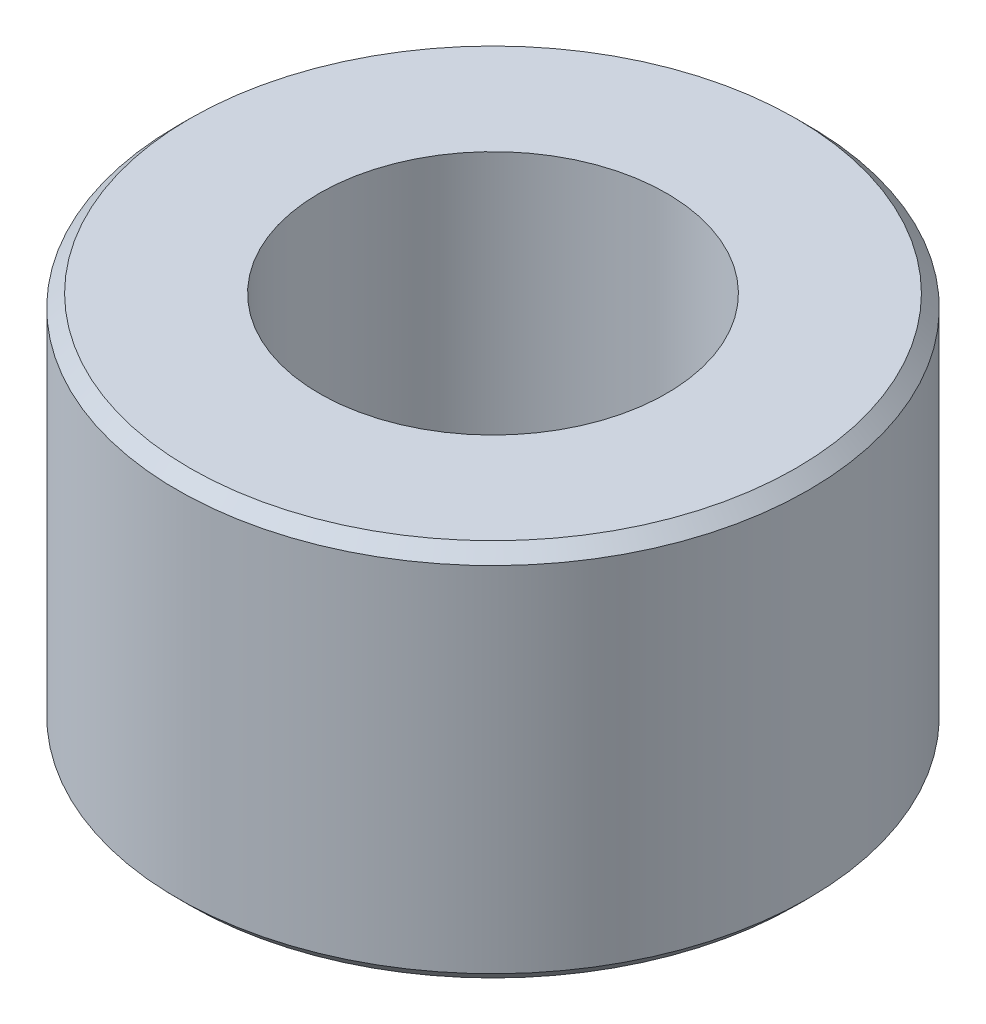
ISO-10303-21;
HEADER;
FILE_DESCRIPTION(('STEP AP214'),'2;1');
FILE_NAME('part.step','',(''),(''),'','','');
FILE_SCHEMA(('AUTOMOTIVE_DESIGN { 1 0 10303 214 1 1 1 1 }'));
ENDSEC;
DATA;
#1=APPLICATION_CONTEXT('core data for automotive mechanical design processes');
#2=APPLICATION_PROTOCOL_DEFINITION('international standard','automotive_design',2000,#1);
#3=PRODUCT_CONTEXT('',#1,'mechanical');
#4=PRODUCT('Part','Part','',(#3));
#5=PRODUCT_RELATED_PRODUCT_CATEGORY('part','',(#4));
#6=PRODUCT_DEFINITION_FORMATION('','',#4);
#7=PRODUCT_DEFINITION_CONTEXT('part definition',#1,'design');
#8=PRODUCT_DEFINITION('design','',#6,#7);
#9=PRODUCT_DEFINITION_SHAPE('','',#8);
#10=(LENGTH_UNIT() NAMED_UNIT(*) SI_UNIT(.MILLI.,.METRE.));
#11=(NAMED_UNIT(*) PLANE_ANGLE_UNIT() SI_UNIT($,.RADIAN.));
#12=(NAMED_UNIT(*) SI_UNIT($,.STERADIAN.) SOLID_ANGLE_UNIT());
#13=UNCERTAINTY_MEASURE_WITH_UNIT(LENGTH_MEASURE(1.E-05),#10,'distance_accuracy_value','');
#14=(GEOMETRIC_REPRESENTATION_CONTEXT(3) GLOBAL_UNCERTAINTY_ASSIGNED_CONTEXT((#13)) GLOBAL_UNIT_ASSIGNED_CONTEXT((#10,
#11,#12)) REPRESENTATION_CONTEXT('',''));
#15=CARTESIAN_POINT('',(0.,0.,0.));
#16=DIRECTION('',(0.,0.,1.));
#17=DIRECTION('',(1.,0.,0.));
#18=AXIS2_PLACEMENT_3D('',#15,#16,#17);
#19=CARTESIAN_POINT('',(0.,0.1,0.));
#20=DIRECTION('',(0.,1.,0.));
#21=DIRECTION('',(1.,0.,0.));
#22=AXIS2_PLACEMENT_3D('',#19,#20,#21);
#23=CONICAL_SURFACE('',#22,4.9,0.785398163397449);
#24=CARTESIAN_POINT('',(0.,0.2,0.));
#25=DIRECTION('',(0.,-1.,0.));
#26=DIRECTION('',(1.,0.,0.));
#27=AXIS2_PLACEMENT_3D('',#24,#25,#26);
#28=CIRCLE('',#27,5.);
#29=CARTESIAN_POINT('',(-5.,0.2,0.));
#30=VERTEX_POINT('',#29);
#31=EDGE_CURVE('E11',#30,#30,#28,.T.);
#32=ORIENTED_EDGE('',*,*,#31,.T.);
#33=EDGE_LOOP('',(#32));
#34=FACE_BOUND('',#33,.T.);
#35=CARTESIAN_POINT('',(0.,0.,0.));
#36=DIRECTION('',(0.,1.,0.));
#37=DIRECTION('',(1.,0.,0.));
#38=AXIS2_PLACEMENT_3D('',#35,#36,#37);
#39=CIRCLE('',#38,4.8);
#40=CARTESIAN_POINT('',(-4.8,0.,0.));
#41=VERTEX_POINT('',#40);
#42=EDGE_CURVE('E27',#41,#41,#39,.T.);
#43=ORIENTED_EDGE('',*,*,#42,.T.);
#44=EDGE_LOOP('',(#43));
#45=FACE_BOUND('',#44,.T.);
#46=ADVANCED_FACE('F16',(#34,#45),#23,.T.);
#47=CARTESIAN_POINT('',(0.,0.,0.));
#48=DIRECTION('',(0.,-1.,0.));
#49=DIRECTION('',(1.,0.,0.));
#50=AXIS2_PLACEMENT_3D('',#47,#48,#49);
#51=CYLINDRICAL_SURFACE('',#50,5.);
#52=CARTESIAN_POINT('',(0.,5.8,0.));
#53=DIRECTION('',(0.,1.,0.));
#54=DIRECTION('',(1.,0.,0.));
#55=AXIS2_PLACEMENT_3D('',#52,#53,#54);
#56=CIRCLE('',#55,5.);
#57=CARTESIAN_POINT('',(-5.,5.8,0.));
#58=VERTEX_POINT('',#57);
#59=EDGE_CURVE('E45',#58,#58,#56,.T.);
#60=ORIENTED_EDGE('',*,*,#59,.F.);
#61=EDGE_LOOP('',(#60));
#62=FACE_BOUND('',#61,.T.);
#63=ORIENTED_EDGE('',*,*,#31,.F.);
#64=EDGE_LOOP('',(#63));
#65=FACE_BOUND('',#64,.T.);
#66=ADVANCED_FACE('F46',(#62,#65),#51,.T.);
#67=CARTESIAN_POINT('',(0.,0.,0.));
#68=DIRECTION('',(0.,1.,0.));
#69=DIRECTION('',(0.,0.,1.));
#70=AXIS2_PLACEMENT_3D('',#67,#68,#69);
#71=PLANE('',#70);
#72=CARTESIAN_POINT('',(0.,0.,0.));
#73=DIRECTION('',(0.,1.,0.));
#74=DIRECTION('',(1.,0.,0.));
#75=AXIS2_PLACEMENT_3D('',#72,#73,#74);
#76=CIRCLE('',#75,2.75);
#77=CARTESIAN_POINT('',(-2.75,0.,0.));
#78=VERTEX_POINT('',#77);
#79=EDGE_CURVE('E20',#78,#78,#76,.T.);
#80=ORIENTED_EDGE('',*,*,#79,.T.);
#81=EDGE_LOOP('',(#80));
#82=FACE_BOUND('',#81,.T.);
#83=ORIENTED_EDGE('',*,*,#42,.F.);
#84=EDGE_LOOP('',(#83));
#85=FACE_BOUND('',#84,.T.);
#86=ADVANCED_FACE('F18',(#82,#85),#71,.F.);
#87=CARTESIAN_POINT('',(0.,5.9,0.));
#88=DIRECTION('',(0.,-1.,0.));
#89=DIRECTION('',(1.,0.,0.));
#90=AXIS2_PLACEMENT_3D('',#87,#88,#89);
#91=CONICAL_SURFACE('',#90,4.9,0.785398163397448);
#92=ORIENTED_EDGE('',*,*,#59,.T.);
#93=EDGE_LOOP('',(#92));
#94=FACE_BOUND('',#93,.T.);
#95=CARTESIAN_POINT('',(0.,6.,0.));
#96=DIRECTION('',(0.,-1.,0.));
#97=DIRECTION('',(1.,0.,0.));
#98=AXIS2_PLACEMENT_3D('',#95,#96,#97);
#99=CIRCLE('',#98,4.8);
#100=CARTESIAN_POINT('',(-4.8,6.,0.));
#101=VERTEX_POINT('',#100);
#102=EDGE_CURVE('E49',#101,#101,#99,.T.);
#103=ORIENTED_EDGE('',*,*,#102,.T.);
#104=EDGE_LOOP('',(#103));
#105=FACE_BOUND('',#104,.T.);
#106=ADVANCED_FACE('F66',(#94,#105),#91,.T.);
#107=CARTESIAN_POINT('',(0.,6.,0.));
#108=DIRECTION('',(0.,1.,0.));
#109=DIRECTION('',(0.,0.,1.));
#110=AXIS2_PLACEMENT_3D('',#107,#108,#109);
#111=PLANE('',#110);
#112=CARTESIAN_POINT('',(0.,6.,0.));
#113=DIRECTION('',(0.,-1.,0.));
#114=DIRECTION('',(1.,0.,0.));
#115=AXIS2_PLACEMENT_3D('',#112,#113,#114);
#116=CIRCLE('',#115,2.75);
#117=CARTESIAN_POINT('',(-2.75,6.,0.));
#118=VERTEX_POINT('',#117);
#119=EDGE_CURVE('E57',#118,#118,#116,.T.);
#120=ORIENTED_EDGE('',*,*,#119,.T.);
#121=EDGE_LOOP('',(#120));
#122=FACE_BOUND('',#121,.T.);
#123=ORIENTED_EDGE('',*,*,#102,.F.);
#124=EDGE_LOOP('',(#123));
#125=FACE_BOUND('',#124,.T.);
#126=ADVANCED_FACE('F72',(#122,#125),#111,.T.);
#127=CARTESIAN_POINT('',(0.,0.,0.));
#128=DIRECTION('',(0.,-1.,0.));
#129=DIRECTION('',(1.,0.,0.));
#130=AXIS2_PLACEMENT_3D('',#127,#128,#129);
#131=CYLINDRICAL_SURFACE('',#130,2.75);
#132=ORIENTED_EDGE('',*,*,#119,.F.);
#133=EDGE_LOOP('',(#132));
#134=FACE_BOUND('',#133,.T.);
#135=ORIENTED_EDGE('',*,*,#79,.F.);
#136=EDGE_LOOP('',(#135));
#137=FACE_BOUND('',#136,.T.);
#138=ADVANCED_FACE('F80',(#134,#137),#131,.F.);
#139=CLOSED_SHELL('',(#46,#66,#86,#106,#126,#138));
#140=MANIFOLD_SOLID_BREP('B1',#139);
#141=ADVANCED_BREP_SHAPE_REPRESENTATION('',(#18,#140),#14);
#142=SHAPE_DEFINITION_REPRESENTATION(#9,#141);
ENDSEC;
END-ISO-10303-21;
